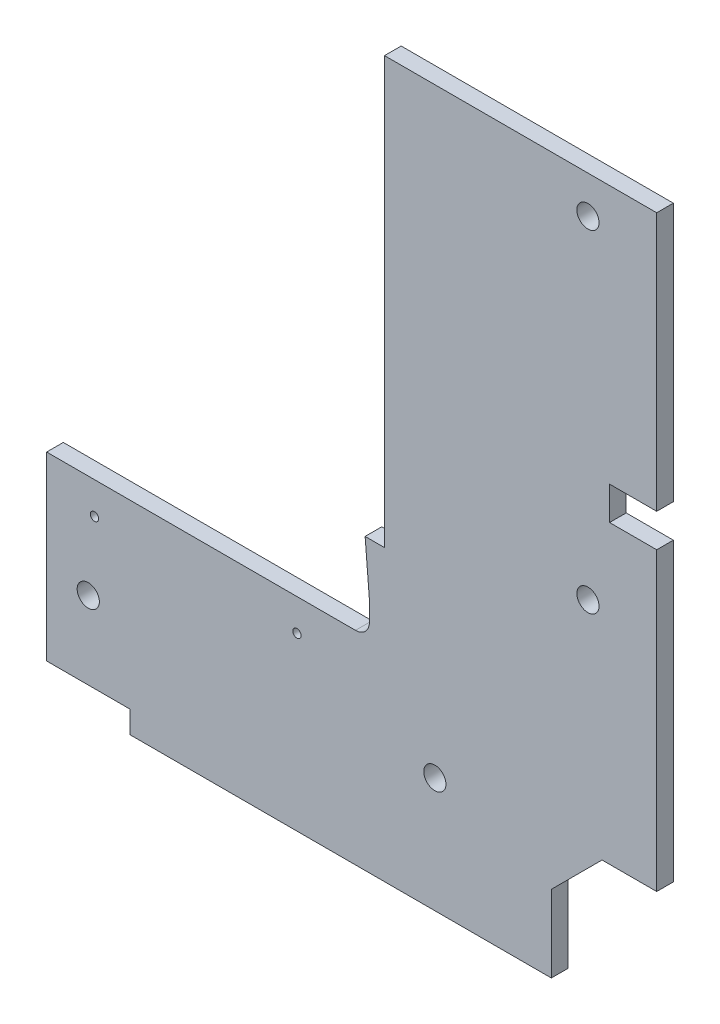
ISO-10303-21;
HEADER;
FILE_DESCRIPTION(('STEP AP214'),'2;1');
FILE_NAME('part.step','',(''),(''),'','','');
FILE_SCHEMA(('AUTOMOTIVE_DESIGN { 1 0 10303 214 1 1 1 1 }'));
ENDSEC;
DATA;
#1=APPLICATION_CONTEXT('core data for automotive mechanical design processes');
#2=APPLICATION_PROTOCOL_DEFINITION('international standard','automotive_design',2000,#1);
#3=PRODUCT_CONTEXT('',#1,'mechanical');
#4=PRODUCT('Part','Part','',(#3));
#5=PRODUCT_RELATED_PRODUCT_CATEGORY('part','',(#4));
#6=PRODUCT_DEFINITION_FORMATION('','',#4);
#7=PRODUCT_DEFINITION_CONTEXT('part definition',#1,'design');
#8=PRODUCT_DEFINITION('design','',#6,#7);
#9=PRODUCT_DEFINITION_SHAPE('','',#8);
#10=(LENGTH_UNIT() NAMED_UNIT(*) SI_UNIT(.MILLI.,.METRE.));
#11=(NAMED_UNIT(*) PLANE_ANGLE_UNIT() SI_UNIT($,.RADIAN.));
#12=(NAMED_UNIT(*) SI_UNIT($,.STERADIAN.) SOLID_ANGLE_UNIT());
#13=UNCERTAINTY_MEASURE_WITH_UNIT(LENGTH_MEASURE(1.E-05),#10,'distance_accuracy_value','');
#14=(GEOMETRIC_REPRESENTATION_CONTEXT(3) GLOBAL_UNCERTAINTY_ASSIGNED_CONTEXT((#13)) GLOBAL_UNIT_ASSIGNED_CONTEXT((#10,
#11,#12)) REPRESENTATION_CONTEXT('',''));
#15=CARTESIAN_POINT('',(0.,0.,0.));
#16=DIRECTION('',(0.,0.,1.));
#17=DIRECTION('',(1.,0.,0.));
#18=AXIS2_PLACEMENT_3D('',#15,#16,#17);
#19=CARTESIAN_POINT('',(0.,259.8,6.));
#20=DIRECTION('',(-1.,0.,0.));
#21=DIRECTION('',(0.,-1.,0.));
#22=AXIS2_PLACEMENT_3D('',#19,#20,#21);
#23=PLANE('',#22);
#24=DIRECTION('',(0.,1.,0.));
#25=VECTOR('',#24,1.);
#26=CARTESIAN_POINT('',(0.,259.8,0.));
#27=LINE('',#26,#25);
#28=CARTESIAN_POINT('',(0.,46.3,0.));
#29=VERTEX_POINT('',#28);
#30=CARTESIAN_POINT('',(0.,153.05,0.));
#31=VERTEX_POINT('',#30);
#32=EDGE_CURVE('E199',#29,#31,#27,.T.);
#33=ORIENTED_EDGE('',*,*,#32,.T.);
#34=DIRECTION('',(0.,0.,1.));
#35=VECTOR('',#34,1.);
#36=CARTESIAN_POINT('',(0.,153.05,-4.));
#37=LINE('',#36,#35);
#38=CARTESIAN_POINT('',(0.,153.05,6.));
#39=VERTEX_POINT('',#38);
#40=EDGE_CURVE('E236',#31,#39,#37,.T.);
#41=ORIENTED_EDGE('',*,*,#40,.T.);
#42=DIRECTION('',(0.,1.,0.));
#43=VECTOR('',#42,1.);
#44=CARTESIAN_POINT('',(0.,259.8,6.));
#45=LINE('',#44,#43);
#46=CARTESIAN_POINT('',(0.,46.3,6.));
#47=VERTEX_POINT('',#46);
#48=EDGE_CURVE('E409',#47,#39,#45,.T.);
#49=ORIENTED_EDGE('',*,*,#48,.F.);
#50=DIRECTION('',(0.,0.,1.));
#51=VECTOR('',#50,1.);
#52=CARTESIAN_POINT('',(0.,46.3,0.));
#53=LINE('',#52,#51);
#54=EDGE_CURVE('E362',#29,#47,#53,.T.);
#55=ORIENTED_EDGE('',*,*,#54,.F.);
#56=EDGE_LOOP('',(#33,#41,#49,#55));
#57=FACE_BOUND('',#56,.T.);
#58=ADVANCED_FACE('F43',(#57),#23,.F.);
#59=CARTESIAN_POINT('',(0.,165.05,0.));
#60=VERTEX_POINT('',#59);
#61=CARTESIAN_POINT('',(0.,258.3,0.));
#62=VERTEX_POINT('',#61);
#63=EDGE_CURVE('E191',#60,#62,#27,.T.);
#64=ORIENTED_EDGE('',*,*,#63,.T.);
#65=DIRECTION('',(0.,0.,1.));
#66=VECTOR('',#65,1.);
#67=CARTESIAN_POINT('',(0.,258.3,0.));
#68=LINE('',#67,#66);
#69=CARTESIAN_POINT('',(0.,258.3,6.));
#70=VERTEX_POINT('',#69);
#71=EDGE_CURVE('E173',#62,#70,#68,.T.);
#72=ORIENTED_EDGE('',*,*,#71,.T.);
#73=CARTESIAN_POINT('',(0.,165.05,6.));
#74=VERTEX_POINT('',#73);
#75=EDGE_CURVE('E216',#74,#70,#45,.T.);
#76=ORIENTED_EDGE('',*,*,#75,.F.);
#77=DIRECTION('',(0.,0.,1.));
#78=VECTOR('',#77,1.);
#79=CARTESIAN_POINT('',(0.,165.05,-4.));
#80=LINE('',#79,#78);
#81=EDGE_CURVE('E197',#60,#74,#80,.T.);
#82=ORIENTED_EDGE('',*,*,#81,.F.);
#83=EDGE_LOOP('',(#64,#72,#76,#82));
#84=FACE_BOUND('',#83,.T.);
#85=ADVANCED_FACE('F45',(#84),#23,.F.);
#86=CARTESIAN_POINT('',(-220.,0.,6.));
#87=DIRECTION('',(1.,0.,0.));
#88=DIRECTION('',(0.,0.,-1.));
#89=AXIS2_PLACEMENT_3D('',#86,#87,#88);
#90=PLANE('',#89);
#91=DIRECTION('',(0.,-1.,0.));
#92=VECTOR('',#91,1.);
#93=CARTESIAN_POINT('',(-220.,0.,0.));
#94=LINE('',#93,#92);
#95=CARTESIAN_POINT('',(-220.,73.57,0.));
#96=VERTEX_POINT('',#95);
#97=CARTESIAN_POINT('',(-220.,8.29999999999997,0.));
#98=VERTEX_POINT('',#97);
#99=EDGE_CURVE('E205',#96,#98,#94,.T.);
#100=ORIENTED_EDGE('',*,*,#99,.T.);
#101=DIRECTION('',(0.,0.,1.));
#102=VECTOR('',#101,1.);
#103=CARTESIAN_POINT('',(-220.,8.29999999999997,0.));
#104=LINE('',#103,#102);
#105=CARTESIAN_POINT('',(-220.,8.29999999999997,6.));
#106=VERTEX_POINT('',#105);
#107=EDGE_CURVE('E200',#98,#106,#104,.T.);
#108=ORIENTED_EDGE('',*,*,#107,.T.);
#109=DIRECTION('',(0.,-1.,0.));
#110=VECTOR('',#109,1.);
#111=CARTESIAN_POINT('',(-220.,0.,6.));
#112=LINE('',#111,#110);
#113=CARTESIAN_POINT('',(-220.,73.57,6.));
#114=VERTEX_POINT('',#113);
#115=EDGE_CURVE('E211',#114,#106,#112,.T.);
#116=ORIENTED_EDGE('',*,*,#115,.F.);
#117=DIRECTION('',(0.,0.,1.));
#118=VECTOR('',#117,1.);
#119=CARTESIAN_POINT('',(-220.,73.57,0.));
#120=LINE('',#119,#118);
#121=EDGE_CURVE('E322',#96,#114,#120,.T.);
#122=ORIENTED_EDGE('',*,*,#121,.F.);
#123=EDGE_LOOP('',(#100,#108,#116,#122));
#124=FACE_BOUND('',#123,.T.);
#125=ADVANCED_FACE('F461',(#124),#90,.F.);
#126=CARTESIAN_POINT('',(-116.389393610517,86.3461185088257,6.));
#127=DIRECTION('',(0.,0.,1.));
#128=DIRECTION('',(1.,0.,0.));
#129=AXIS2_PLACEMENT_3D('',#126,#127,#128);
#130=PLANE('',#129);
#131=DIRECTION('',(1.,0.,0.));
#132=VECTOR('',#131,1.);
#133=CARTESIAN_POINT('',(-98.1575266786795,258.3,6.));
#134=LINE('',#133,#132);
#135=CARTESIAN_POINT('',(-98.1575266786795,258.3,6.));
#136=VERTEX_POINT('',#135);
#137=EDGE_CURVE('E176',#136,#70,#134,.T.);
#138=ORIENTED_EDGE('',*,*,#137,.F.);
#139=DIRECTION('',(0.,-1.,0.));
#140=VECTOR('',#139,1.);
#141=CARTESIAN_POINT('',(-98.1575266786795,104.64,6.));
#142=LINE('',#141,#140);
#143=CARTESIAN_POINT('',(-98.1575266786795,104.64,6.));
#144=VERTEX_POINT('',#143);
#145=EDGE_CURVE('E182',#136,#144,#142,.T.);
#146=ORIENTED_EDGE('',*,*,#145,.T.);
#147=DIRECTION('',(-1.,0.,0.));
#148=VECTOR('',#147,1.);
#149=CARTESIAN_POINT('',(-98.1575266786795,104.64,6.));
#150=LINE('',#149,#148);
#151=CARTESIAN_POINT('',(-105.154959957925,104.64,6.));
#152=VERTEX_POINT('',#151);
#153=EDGE_CURVE('E329',#144,#152,#150,.T.);
#154=ORIENTED_EDGE('',*,*,#153,.T.);
#155=DIRECTION('',(0.0812879696273212,-0.996690657121791,0.));
#156=VECTOR('',#155,1.);
#157=CARTESIAN_POINT('',(-105.,102.74,6.));
#158=LINE('',#157,#156);
#159=CARTESIAN_POINT('',(-103.622774873519,85.8535231620348,6.));
#160=VERTEX_POINT('',#159);
#161=EDGE_CURVE('E342',#152,#160,#158,.T.);
#162=ORIENTED_EDGE('',*,*,#161,.T.);
#163=DIRECTION('',(0.,1.,0.));
#164=VECTOR('',#163,1.);
#165=CARTESIAN_POINT('',(-103.622774873519,85.8535231620348,6.));
#166=LINE('',#165,#164);
#167=CARTESIAN_POINT('',(-103.622774873519,78.57,6.));
#168=VERTEX_POINT('',#167);
#169=EDGE_CURVE('E281',#168,#160,#166,.T.);
#170=ORIENTED_EDGE('',*,*,#169,.F.);
#171=CARTESIAN_POINT('',(-108.622774873519,78.57,6.));
#172=DIRECTION('',(0.,0.,1.));
#173=DIRECTION('',(1.,0.,0.));
#174=AXIS2_PLACEMENT_3D('',#171,#172,#173);
#175=CIRCLE('',#174,5.);
#176=CARTESIAN_POINT('',(-108.622774873519,73.57,6.));
#177=VERTEX_POINT('',#176);
#178=EDGE_CURVE('E275',#177,#168,#175,.T.);
#179=ORIENTED_EDGE('',*,*,#178,.F.);
#180=DIRECTION('',(-1.,0.,0.));
#181=VECTOR('',#180,1.);
#182=CARTESIAN_POINT('',(-220.,73.57,6.));
#183=LINE('',#182,#181);
#184=EDGE_CURVE('E317',#177,#114,#183,.T.);
#185=ORIENTED_EDGE('',*,*,#184,.T.);
#186=ORIENTED_EDGE('',*,*,#115,.T.);
#187=DIRECTION('',(-1.,0.,0.));
#188=VECTOR('',#187,1.);
#189=CARTESIAN_POINT('',(-220.,8.29999999999997,6.));
#190=LINE('',#189,#188);
#191=CARTESIAN_POINT('',(-190.,8.29999999999997,6.));
#192=VERTEX_POINT('',#191);
#193=EDGE_CURVE('E399',#192,#106,#190,.T.);
#194=ORIENTED_EDGE('',*,*,#193,.F.);
#195=DIRECTION('',(0.,1.,0.));
#196=VECTOR('',#195,1.);
#197=CARTESIAN_POINT('',(-190.,0.,6.));
#198=LINE('',#197,#196);
#199=CARTESIAN_POINT('',(-190.,0.299999999999973,6.));
#200=VERTEX_POINT('',#199);
#201=EDGE_CURVE('E383',#200,#192,#198,.T.);
#202=ORIENTED_EDGE('',*,*,#201,.F.);
#203=DIRECTION('',(-1.,0.,0.));
#204=VECTOR('',#203,1.);
#205=CARTESIAN_POINT('',(-190.,0.299999999999973,6.));
#206=LINE('',#205,#204);
#207=CARTESIAN_POINT('',(-38.,0.299999999999973,6.));
#208=VERTEX_POINT('',#207);
#209=EDGE_CURVE('E261',#208,#200,#206,.T.);
#210=ORIENTED_EDGE('',*,*,#209,.F.);
#211=DIRECTION('',(0.,-1.,0.));
#212=VECTOR('',#211,1.);
#213=CARTESIAN_POINT('',(-38.,0.,6.));
#214=LINE('',#213,#212);
#215=CARTESIAN_POINT('',(-38.,28.,6.));
#216=VERTEX_POINT('',#215);
#217=EDGE_CURVE('E358',#216,#208,#214,.T.);
#218=ORIENTED_EDGE('',*,*,#217,.F.);
#219=DIRECTION('',(-0.707106781186547,-0.707106781186548,0.));
#220=VECTOR('',#219,1.);
#221=CARTESIAN_POINT('',(-38.,28.,6.));
#222=LINE('',#221,#220);
#223=CARTESIAN_POINT('',(-19.7,46.3,6.));
#224=VERTEX_POINT('',#223);
#225=EDGE_CURVE('E241',#224,#216,#222,.T.);
#226=ORIENTED_EDGE('',*,*,#225,.F.);
#227=DIRECTION('',(-1.,0.,0.));
#228=VECTOR('',#227,1.);
#229=CARTESIAN_POINT('',(-10.7,46.3,6.));
#230=LINE('',#229,#228);
#231=EDGE_CURVE('E350',#47,#224,#230,.T.);
#232=ORIENTED_EDGE('',*,*,#231,.F.);
#233=ORIENTED_EDGE('',*,*,#48,.T.);
#234=DIRECTION('',(1.,0.,0.));
#235=VECTOR('',#234,1.);
#236=CARTESIAN_POINT('',(0.,153.05,6.));
#237=LINE('',#236,#235);
#238=CARTESIAN_POINT('',(-17.,153.05,6.));
#239=VERTEX_POINT('',#238);
#240=EDGE_CURVE('E248',#239,#39,#237,.T.);
#241=ORIENTED_EDGE('',*,*,#240,.F.);
#242=DIRECTION('',(0.,-1.,0.));
#243=VECTOR('',#242,1.);
#244=CARTESIAN_POINT('',(-17.,153.05,6.));
#245=LINE('',#244,#243);
#246=CARTESIAN_POINT('',(-17.,165.05,6.));
#247=VERTEX_POINT('',#246);
#248=EDGE_CURVE('E232',#247,#239,#245,.T.);
#249=ORIENTED_EDGE('',*,*,#248,.F.);
#250=DIRECTION('',(-1.,0.,0.));
#251=VECTOR('',#250,1.);
#252=CARTESIAN_POINT('',(0.,165.05,6.));
#253=LINE('',#252,#251);
#254=EDGE_CURVE('E422',#74,#247,#253,.T.);
#255=ORIENTED_EDGE('',*,*,#254,.F.);
#256=ORIENTED_EDGE('',*,*,#75,.T.);
#257=EDGE_LOOP('',(#138,#146,#154,#162,#170,#179,#185,#186,#194,#202,#210,#218,#226,#232,#233,
#241,#249,#255,#256));
#258=FACE_BOUND('',#257,.T.);
#259=CARTESIAN_POINT('',(-80.,41.8,6.));
#260=DIRECTION('',(0.,0.,1.));
#261=DIRECTION('',(1.,0.,0.));
#262=AXIS2_PLACEMENT_3D('',#259,#260,#261);
#263=CIRCLE('',#262,4.00000000000001);
#264=CARTESIAN_POINT('',(-76.,41.8,6.));
#265=VERTEX_POINT('',#264);
#266=EDGE_CURVE('E430',#265,#265,#263,.T.);
#267=ORIENTED_EDGE('',*,*,#266,.F.);
#268=EDGE_LOOP('',(#267));
#269=FACE_BOUND('',#268,.T.);
#270=CARTESIAN_POINT('',(-202.75,62.07,6.));
#271=DIRECTION('',(0.,0.,1.));
#272=DIRECTION('',(1.,0.,0.));
#273=AXIS2_PLACEMENT_3D('',#270,#271,#272);
#274=CIRCLE('',#273,1.5);
#275=CARTESIAN_POINT('',(-201.25,62.07,6.));
#276=VERTEX_POINT('',#275);
#277=EDGE_CURVE('E303',#276,#276,#274,.T.);
#278=ORIENTED_EDGE('',*,*,#277,.F.);
#279=EDGE_LOOP('',(#278));
#280=FACE_BOUND('',#279,.T.);
#281=CARTESIAN_POINT('',(-129.75,62.07,6.));
#282=DIRECTION('',(0.,0.,1.));
#283=DIRECTION('',(1.,0.,0.));
#284=AXIS2_PLACEMENT_3D('',#281,#282,#283);
#285=CIRCLE('',#284,1.5);
#286=CARTESIAN_POINT('',(-128.25,62.07,6.));
#287=VERTEX_POINT('',#286);
#288=EDGE_CURVE('E294',#287,#287,#285,.T.);
#289=ORIENTED_EDGE('',*,*,#288,.F.);
#290=EDGE_LOOP('',(#289));
#291=FACE_BOUND('',#290,.T.);
#292=CARTESIAN_POINT('',(-24.8,125.,6.));
#293=DIRECTION('',(0.,0.,1.));
#294=DIRECTION('',(1.,0.,0.));
#295=AXIS2_PLACEMENT_3D('',#292,#293,#294);
#296=CIRCLE('',#295,4.00000000000001);
#297=CARTESIAN_POINT('',(-20.8,125.,6.));
#298=VERTEX_POINT('',#297);
#299=EDGE_CURVE('E370',#298,#298,#296,.T.);
#300=ORIENTED_EDGE('',*,*,#299,.F.);
#301=EDGE_LOOP('',(#300));
#302=FACE_BOUND('',#301,.T.);
#303=CARTESIAN_POINT('',(-24.8,244.8,6.));
#304=DIRECTION('',(0.,0.,1.));
#305=DIRECTION('',(1.,0.,0.));
#306=AXIS2_PLACEMENT_3D('',#303,#304,#305);
#307=CIRCLE('',#306,4.00000000000001);
#308=CARTESIAN_POINT('',(-20.8,244.8,6.));
#309=VERTEX_POINT('',#308);
#310=EDGE_CURVE('E375',#309,#309,#307,.T.);
#311=ORIENTED_EDGE('',*,*,#310,.F.);
#312=EDGE_LOOP('',(#311));
#313=FACE_BOUND('',#312,.T.);
#314=CARTESIAN_POINT('',(-205.,36.3,6.));
#315=DIRECTION('',(0.,0.,1.));
#316=DIRECTION('',(1.,0.,0.));
#317=AXIS2_PLACEMENT_3D('',#314,#315,#316);
#318=CIRCLE('',#317,3.99999999999999);
#319=CARTESIAN_POINT('',(-201.,36.3,6.));
#320=VERTEX_POINT('',#319);
#321=EDGE_CURVE('E384',#320,#320,#318,.T.);
#322=ORIENTED_EDGE('',*,*,#321,.F.);
#323=EDGE_LOOP('',(#322));
#324=FACE_BOUND('',#323,.T.);
#325=ADVANCED_FACE('F419',(#258,#269,#280,#291,#302,#313,#324),#130,.T.);
#326=CARTESIAN_POINT('',(-116.389393610517,86.3461185088257,0.));
#327=DIRECTION('',(0.,0.,1.));
#328=DIRECTION('',(1.,0.,0.));
#329=AXIS2_PLACEMENT_3D('',#326,#327,#328);
#330=PLANE('',#329);
#331=CARTESIAN_POINT('',(-202.75,62.07,0.));
#332=DIRECTION('',(0.,0.,1.));
#333=DIRECTION('',(1.,0.,0.));
#334=AXIS2_PLACEMENT_3D('',#331,#332,#333);
#335=CIRCLE('',#334,1.5);
#336=CARTESIAN_POINT('',(-201.25,62.07,0.));
#337=VERTEX_POINT('',#336);
#338=EDGE_CURVE('E298',#337,#337,#335,.T.);
#339=ORIENTED_EDGE('',*,*,#338,.T.);
#340=EDGE_LOOP('',(#339));
#341=FACE_BOUND('',#340,.T.);
#342=CARTESIAN_POINT('',(-129.75,62.07,0.));
#343=DIRECTION('',(0.,0.,1.));
#344=DIRECTION('',(1.,0.,0.));
#345=AXIS2_PLACEMENT_3D('',#342,#343,#344);
#346=CIRCLE('',#345,1.5);
#347=CARTESIAN_POINT('',(-128.25,62.07,0.));
#348=VERTEX_POINT('',#347);
#349=EDGE_CURVE('E307',#348,#348,#346,.T.);
#350=ORIENTED_EDGE('',*,*,#349,.T.);
#351=EDGE_LOOP('',(#350));
#352=FACE_BOUND('',#351,.T.);
#353=DIRECTION('',(0.,-1.,0.));
#354=VECTOR('',#353,1.);
#355=CARTESIAN_POINT('',(-98.1575266786795,104.64,0.));
#356=LINE('',#355,#354);
#357=CARTESIAN_POINT('',(-98.1575266786795,258.3,0.));
#358=VERTEX_POINT('',#357);
#359=CARTESIAN_POINT('',(-98.1575266786795,104.64,0.));
#360=VERTEX_POINT('',#359);
#361=EDGE_CURVE('E193',#358,#360,#356,.T.);
#362=ORIENTED_EDGE('',*,*,#361,.F.);
#363=DIRECTION('',(1.,0.,0.));
#364=VECTOR('',#363,1.);
#365=CARTESIAN_POINT('',(-98.1575266786795,258.3,0.));
#366=LINE('',#365,#364);
#367=EDGE_CURVE('E59',#358,#62,#366,.T.);
#368=ORIENTED_EDGE('',*,*,#367,.T.);
#369=ORIENTED_EDGE('',*,*,#63,.F.);
#370=DIRECTION('',(-1.,0.,0.));
#371=VECTOR('',#370,1.);
#372=CARTESIAN_POINT('',(-116.389393610517,165.05,0.));
#373=LINE('',#372,#371);
#374=CARTESIAN_POINT('',(-17.,165.05,0.));
#375=VERTEX_POINT('',#374);
#376=EDGE_CURVE('E221',#60,#375,#373,.T.);
#377=ORIENTED_EDGE('',*,*,#376,.T.);
#378=DIRECTION('',(0.,-1.,0.));
#379=VECTOR('',#378,1.);
#380=CARTESIAN_POINT('',(-17.,86.3461185088257,0.));
#381=LINE('',#380,#379);
#382=CARTESIAN_POINT('',(-17.,153.05,0.));
#383=VERTEX_POINT('',#382);
#384=EDGE_CURVE('E52',#375,#383,#381,.T.);
#385=ORIENTED_EDGE('',*,*,#384,.T.);
#386=DIRECTION('',(1.,0.,0.));
#387=VECTOR('',#386,1.);
#388=CARTESIAN_POINT('',(-116.389393610517,153.05,0.));
#389=LINE('',#388,#387);
#390=EDGE_CURVE('E11',#383,#31,#389,.T.);
#391=ORIENTED_EDGE('',*,*,#390,.T.);
#392=ORIENTED_EDGE('',*,*,#32,.F.);
#393=DIRECTION('',(-1.,0.,0.));
#394=VECTOR('',#393,1.);
#395=CARTESIAN_POINT('',(-10.7,46.3,0.));
#396=LINE('',#395,#394);
#397=CARTESIAN_POINT('',(-19.7,46.3,0.));
#398=VERTEX_POINT('',#397);
#399=EDGE_CURVE('E354',#29,#398,#396,.T.);
#400=ORIENTED_EDGE('',*,*,#399,.T.);
#401=DIRECTION('',(-0.707106781186547,-0.707106781186548,0.));
#402=VECTOR('',#401,1.);
#403=CARTESIAN_POINT('',(-38.,28.,0.));
#404=LINE('',#403,#402);
#405=CARTESIAN_POINT('',(-38.,28.,0.));
#406=VERTEX_POINT('',#405);
#407=EDGE_CURVE('E249',#398,#406,#404,.T.);
#408=ORIENTED_EDGE('',*,*,#407,.T.);
#409=DIRECTION('',(0.,-1.,0.));
#410=VECTOR('',#409,1.);
#411=CARTESIAN_POINT('',(-38.,0.,0.));
#412=LINE('',#411,#410);
#413=CARTESIAN_POINT('',(-38.,0.299999999999973,0.));
#414=VERTEX_POINT('',#413);
#415=EDGE_CURVE('E357',#406,#414,#412,.T.);
#416=ORIENTED_EDGE('',*,*,#415,.T.);
#417=DIRECTION('',(-1.,0.,0.));
#418=VECTOR('',#417,1.);
#419=CARTESIAN_POINT('',(-116.389393610517,0.299999999999967,0.));
#420=LINE('',#419,#418);
#421=CARTESIAN_POINT('',(-190.,0.299999999999973,0.));
#422=VERTEX_POINT('',#421);
#423=EDGE_CURVE('E271',#414,#422,#420,.T.);
#424=ORIENTED_EDGE('',*,*,#423,.T.);
#425=DIRECTION('',(0.,1.,0.));
#426=VECTOR('',#425,1.);
#427=CARTESIAN_POINT('',(-190.,0.,0.));
#428=LINE('',#427,#426);
#429=CARTESIAN_POINT('',(-190.,8.29999999999997,0.));
#430=VERTEX_POINT('',#429);
#431=EDGE_CURVE('E395',#422,#430,#428,.T.);
#432=ORIENTED_EDGE('',*,*,#431,.T.);
#433=DIRECTION('',(-1.,0.,0.));
#434=VECTOR('',#433,1.);
#435=CARTESIAN_POINT('',(-220.,8.29999999999997,0.));
#436=LINE('',#435,#434);
#437=EDGE_CURVE('E398',#430,#98,#436,.T.);
#438=ORIENTED_EDGE('',*,*,#437,.T.);
#439=ORIENTED_EDGE('',*,*,#99,.F.);
#440=DIRECTION('',(-1.,0.,0.));
#441=VECTOR('',#440,1.);
#442=CARTESIAN_POINT('',(-220.,73.57,0.));
#443=LINE('',#442,#441);
#444=CARTESIAN_POINT('',(-108.622774873519,73.57,0.));
#445=VERTEX_POINT('',#444);
#446=EDGE_CURVE('E318',#445,#96,#443,.T.);
#447=ORIENTED_EDGE('',*,*,#446,.F.);
#448=CARTESIAN_POINT('',(-108.622774873519,78.57,0.));
#449=DIRECTION('',(0.,0.,1.));
#450=DIRECTION('',(1.,0.,0.));
#451=AXIS2_PLACEMENT_3D('',#448,#449,#450);
#452=CIRCLE('',#451,5.);
#453=CARTESIAN_POINT('',(-103.622774873519,78.57,0.));
#454=VERTEX_POINT('',#453);
#455=EDGE_CURVE('E276',#445,#454,#452,.T.);
#456=ORIENTED_EDGE('',*,*,#455,.T.);
#457=DIRECTION('',(0.,1.,0.));
#458=VECTOR('',#457,1.);
#459=CARTESIAN_POINT('',(-103.622774873519,85.8535231620348,0.));
#460=LINE('',#459,#458);
#461=CARTESIAN_POINT('',(-103.622774873519,85.8535231620348,0.));
#462=VERTEX_POINT('',#461);
#463=EDGE_CURVE('E280',#454,#462,#460,.T.);
#464=ORIENTED_EDGE('',*,*,#463,.T.);
#465=DIRECTION('',(0.0812879696273212,-0.996690657121791,0.));
#466=VECTOR('',#465,1.);
#467=CARTESIAN_POINT('',(-105.,102.74,0.));
#468=LINE('',#467,#466);
#469=CARTESIAN_POINT('',(-105.154959957925,104.64,0.));
#470=VERTEX_POINT('',#469);
#471=EDGE_CURVE('E346',#470,#462,#468,.T.);
#472=ORIENTED_EDGE('',*,*,#471,.F.);
#473=DIRECTION('',(-1.,0.,0.));
#474=VECTOR('',#473,1.);
#475=CARTESIAN_POINT('',(-98.1575266786795,104.64,0.));
#476=LINE('',#475,#474);
#477=EDGE_CURVE('E330',#360,#470,#476,.T.);
#478=ORIENTED_EDGE('',*,*,#477,.F.);
#479=EDGE_LOOP('',(#362,#368,#369,#377,#385,#391,#392,#400,#408,#416,#424,#432,#438,#439,#447,
#456,#464,#472,#478));
#480=FACE_BOUND('',#479,.T.);
#481=CARTESIAN_POINT('',(-80.,41.8,0.));
#482=DIRECTION('',(0.,0.,1.));
#483=DIRECTION('',(1.,0.,0.));
#484=AXIS2_PLACEMENT_3D('',#481,#482,#483);
#485=CIRCLE('',#484,4.00000000000001);
#486=CARTESIAN_POINT('',(-76.,41.8,0.));
#487=VERTEX_POINT('',#486);
#488=EDGE_CURVE('E424',#487,#487,#485,.T.);
#489=ORIENTED_EDGE('',*,*,#488,.T.);
#490=EDGE_LOOP('',(#489));
#491=FACE_BOUND('',#490,.T.);
#492=CARTESIAN_POINT('',(-24.8,125.,0.));
#493=DIRECTION('',(0.,0.,1.));
#494=DIRECTION('',(1.,0.,0.));
#495=AXIS2_PLACEMENT_3D('',#492,#493,#494);
#496=CIRCLE('',#495,4.00000000000001);
#497=CARTESIAN_POINT('',(-20.8,125.,0.));
#498=VERTEX_POINT('',#497);
#499=EDGE_CURVE('E371',#498,#498,#496,.T.);
#500=ORIENTED_EDGE('',*,*,#499,.T.);
#501=EDGE_LOOP('',(#500));
#502=FACE_BOUND('',#501,.T.);
#503=CARTESIAN_POINT('',(-24.8,244.8,0.));
#504=DIRECTION('',(0.,0.,1.));
#505=DIRECTION('',(1.,0.,0.));
#506=AXIS2_PLACEMENT_3D('',#503,#504,#505);
#507=CIRCLE('',#506,4.00000000000001);
#508=CARTESIAN_POINT('',(-20.8,244.8,0.));
#509=VERTEX_POINT('',#508);
#510=EDGE_CURVE('E388',#509,#509,#507,.T.);
#511=ORIENTED_EDGE('',*,*,#510,.T.);
#512=EDGE_LOOP('',(#511));
#513=FACE_BOUND('',#512,.T.);
#514=CARTESIAN_POINT('',(-205.,36.3,0.));
#515=DIRECTION('',(0.,0.,1.));
#516=DIRECTION('',(1.,0.,0.));
#517=AXIS2_PLACEMENT_3D('',#514,#515,#516);
#518=CIRCLE('',#517,3.99999999999999);
#519=CARTESIAN_POINT('',(-201.,36.3,0.));
#520=VERTEX_POINT('',#519);
#521=EDGE_CURVE('E379',#520,#520,#518,.T.);
#522=ORIENTED_EDGE('',*,*,#521,.T.);
#523=EDGE_LOOP('',(#522));
#524=FACE_BOUND('',#523,.T.);
#525=ADVANCED_FACE('F188',(#341,#352,#480,#491,#502,#513,#524),#330,.F.);
#526=CARTESIAN_POINT('',(-220.,8.29999999999997,0.));
#527=DIRECTION('',(0.,1.,0.));
#528=DIRECTION('',(0.,0.,1.));
#529=AXIS2_PLACEMENT_3D('',#526,#527,#528);
#530=PLANE('',#529);
#531=ORIENTED_EDGE('',*,*,#193,.T.);
#532=ORIENTED_EDGE('',*,*,#107,.F.);
#533=ORIENTED_EDGE('',*,*,#437,.F.);
#534=DIRECTION('',(0.,0.,1.));
#535=VECTOR('',#534,1.);
#536=CARTESIAN_POINT('',(-190.,8.29999999999997,0.));
#537=LINE('',#536,#535);
#538=EDGE_CURVE('E207',#430,#192,#537,.T.);
#539=ORIENTED_EDGE('',*,*,#538,.T.);
#540=EDGE_LOOP('',(#531,#532,#533,#539));
#541=FACE_BOUND('',#540,.T.);
#542=ADVANCED_FACE('F456',(#541),#530,.F.);
#543=CARTESIAN_POINT('',(-190.,0.,0.));
#544=DIRECTION('',(1.,0.,0.));
#545=DIRECTION('',(0.,0.,-1.));
#546=AXIS2_PLACEMENT_3D('',#543,#544,#545);
#547=PLANE('',#546);
#548=ORIENTED_EDGE('',*,*,#431,.F.);
#549=DIRECTION('',(0.,0.,1.));
#550=VECTOR('',#549,1.);
#551=CARTESIAN_POINT('',(-190.,0.299999999999973,-4.));
#552=LINE('',#551,#550);
#553=EDGE_CURVE('E267',#422,#200,#552,.T.);
#554=ORIENTED_EDGE('',*,*,#553,.T.);
#555=ORIENTED_EDGE('',*,*,#201,.T.);
#556=ORIENTED_EDGE('',*,*,#538,.F.);
#557=EDGE_LOOP('',(#548,#554,#555,#556));
#558=FACE_BOUND('',#557,.T.);
#559=ADVANCED_FACE('F452',(#558),#547,.F.);
#560=CARTESIAN_POINT('',(-38.,0.,0.));
#561=DIRECTION('',(-1.,0.,0.));
#562=DIRECTION('',(0.,-1.,0.));
#563=AXIS2_PLACEMENT_3D('',#560,#561,#562);
#564=PLANE('',#563);
#565=ORIENTED_EDGE('',*,*,#217,.T.);
#566=DIRECTION('',(0.,0.,-1.));
#567=VECTOR('',#566,1.);
#568=CARTESIAN_POINT('',(-38.,0.299999999999973,0.));
#569=LINE('',#568,#567);
#570=EDGE_CURVE('E217',#208,#414,#569,.T.);
#571=ORIENTED_EDGE('',*,*,#570,.T.);
#572=ORIENTED_EDGE('',*,*,#415,.F.);
#573=DIRECTION('',(0.,0.,1.));
#574=VECTOR('',#573,1.);
#575=CARTESIAN_POINT('',(-38.,28.,0.));
#576=LINE('',#575,#574);
#577=EDGE_CURVE('E257',#406,#216,#576,.T.);
#578=ORIENTED_EDGE('',*,*,#577,.T.);
#579=EDGE_LOOP('',(#565,#571,#572,#578));
#580=FACE_BOUND('',#579,.T.);
#581=ADVANCED_FACE('F446',(#580),#564,.F.);
#582=CARTESIAN_POINT('',(-10.7,46.3,0.));
#583=DIRECTION('',(0.,1.,0.));
#584=DIRECTION('',(0.,0.,1.));
#585=AXIS2_PLACEMENT_3D('',#582,#583,#584);
#586=PLANE('',#585);
#587=ORIENTED_EDGE('',*,*,#231,.T.);
#588=DIRECTION('',(0.,0.,1.));
#589=VECTOR('',#588,1.);
#590=CARTESIAN_POINT('',(-19.7,46.3,0.));
#591=LINE('',#590,#589);
#592=EDGE_CURVE('E253',#398,#224,#591,.T.);
#593=ORIENTED_EDGE('',*,*,#592,.F.);
#594=ORIENTED_EDGE('',*,*,#399,.F.);
#595=ORIENTED_EDGE('',*,*,#54,.T.);
#596=EDGE_LOOP('',(#587,#593,#594,#595));
#597=FACE_BOUND('',#596,.T.);
#598=ADVANCED_FACE('F440',(#597),#586,.F.);
#599=CARTESIAN_POINT('',(-205.,36.3,0.));
#600=DIRECTION('',(0.,0.,1.));
#601=DIRECTION('',(1.,0.,0.));
#602=AXIS2_PLACEMENT_3D('',#599,#600,#601);
#603=CYLINDRICAL_SURFACE('',#602,3.99999999999999);
#604=ORIENTED_EDGE('',*,*,#521,.F.);
#605=EDGE_LOOP('',(#604));
#606=FACE_BOUND('',#605,.T.);
#607=ORIENTED_EDGE('',*,*,#321,.T.);
#608=EDGE_LOOP('',(#607));
#609=FACE_BOUND('',#608,.T.);
#610=ADVANCED_FACE('F507',(#606,#609),#603,.F.);
#611=CARTESIAN_POINT('',(-24.8,244.8,0.));
#612=DIRECTION('',(0.,0.,1.));
#613=DIRECTION('',(1.,0.,0.));
#614=AXIS2_PLACEMENT_3D('',#611,#612,#613);
#615=CYLINDRICAL_SURFACE('',#614,4.00000000000001);
#616=ORIENTED_EDGE('',*,*,#510,.F.);
#617=EDGE_LOOP('',(#616));
#618=FACE_BOUND('',#617,.T.);
#619=ORIENTED_EDGE('',*,*,#310,.T.);
#620=EDGE_LOOP('',(#619));
#621=FACE_BOUND('',#620,.T.);
#622=ADVANCED_FACE('F509',(#618,#621),#615,.F.);
#623=CARTESIAN_POINT('',(-24.8,125.,0.));
#624=DIRECTION('',(0.,0.,1.));
#625=DIRECTION('',(1.,0.,0.));
#626=AXIS2_PLACEMENT_3D('',#623,#624,#625);
#627=CYLINDRICAL_SURFACE('',#626,4.00000000000001);
#628=ORIENTED_EDGE('',*,*,#499,.F.);
#629=EDGE_LOOP('',(#628));
#630=FACE_BOUND('',#629,.T.);
#631=ORIENTED_EDGE('',*,*,#299,.T.);
#632=EDGE_LOOP('',(#631));
#633=FACE_BOUND('',#632,.T.);
#634=ADVANCED_FACE('F516',(#630,#633),#627,.F.);
#635=CARTESIAN_POINT('',(-105.,102.74,0.));
#636=DIRECTION('',(-0.996690657121791,-0.0812879696273212,0.));
#637=DIRECTION('',(0.0812879696273213,-0.996690657121791,0.));
#638=AXIS2_PLACEMENT_3D('',#635,#636,#637);
#639=PLANE('',#638);
#640=DIRECTION('',(0.,0.,1.));
#641=VECTOR('',#640,1.);
#642=CARTESIAN_POINT('',(-103.622774873519,85.8535231620348,0.));
#643=LINE('',#642,#641);
#644=EDGE_CURVE('E302',#462,#160,#643,.T.);
#645=ORIENTED_EDGE('',*,*,#644,.T.);
#646=ORIENTED_EDGE('',*,*,#161,.F.);
#647=DIRECTION('',(0.,0.,1.));
#648=VECTOR('',#647,1.);
#649=CARTESIAN_POINT('',(-105.154959957925,104.64,0.));
#650=LINE('',#649,#648);
#651=EDGE_CURVE('E338',#470,#152,#650,.T.);
#652=ORIENTED_EDGE('',*,*,#651,.F.);
#653=ORIENTED_EDGE('',*,*,#471,.T.);
#654=EDGE_LOOP('',(#645,#646,#652,#653));
#655=FACE_BOUND('',#654,.T.);
#656=ADVANCED_FACE('F473',(#655),#639,.T.);
#657=CARTESIAN_POINT('',(-98.1575266786795,104.64,0.));
#658=DIRECTION('',(0.,1.,0.));
#659=DIRECTION('',(-1.,0.,0.));
#660=AXIS2_PLACEMENT_3D('',#657,#658,#659);
#661=PLANE('',#660);
#662=ORIENTED_EDGE('',*,*,#153,.F.);
#663=DIRECTION('',(0.,0.,1.));
#664=VECTOR('',#663,1.);
#665=CARTESIAN_POINT('',(-98.1575266786795,104.64,0.));
#666=LINE('',#665,#664);
#667=EDGE_CURVE('E334',#360,#144,#666,.T.);
#668=ORIENTED_EDGE('',*,*,#667,.F.);
#669=ORIENTED_EDGE('',*,*,#477,.T.);
#670=ORIENTED_EDGE('',*,*,#651,.T.);
#671=EDGE_LOOP('',(#662,#668,#669,#670));
#672=FACE_BOUND('',#671,.T.);
#673=ADVANCED_FACE('F478',(#672),#661,.T.);
#674=CARTESIAN_POINT('',(-220.,73.57,0.));
#675=DIRECTION('',(0.,1.,0.));
#676=DIRECTION('',(0.,0.,1.));
#677=AXIS2_PLACEMENT_3D('',#674,#675,#676);
#678=PLANE('',#677);
#679=ORIENTED_EDGE('',*,*,#184,.F.);
#680=DIRECTION('',(0.,0.,1.));
#681=VECTOR('',#680,1.);
#682=CARTESIAN_POINT('',(-108.622774873519,73.57,0.));
#683=LINE('',#682,#681);
#684=EDGE_CURVE('E285',#445,#177,#683,.T.);
#685=ORIENTED_EDGE('',*,*,#684,.F.);
#686=ORIENTED_EDGE('',*,*,#446,.T.);
#687=ORIENTED_EDGE('',*,*,#121,.T.);
#688=EDGE_LOOP('',(#679,#685,#686,#687));
#689=FACE_BOUND('',#688,.T.);
#690=ADVANCED_FACE('F463',(#689),#678,.T.);
#691=CARTESIAN_POINT('',(-129.75,62.07,0.));
#692=DIRECTION('',(0.,0.,1.));
#693=DIRECTION('',(1.,0.,0.));
#694=AXIS2_PLACEMENT_3D('',#691,#692,#693);
#695=CYLINDRICAL_SURFACE('',#694,1.5);
#696=ORIENTED_EDGE('',*,*,#349,.F.);
#697=EDGE_LOOP('',(#696));
#698=FACE_BOUND('',#697,.T.);
#699=ORIENTED_EDGE('',*,*,#288,.T.);
#700=EDGE_LOOP('',(#699));
#701=FACE_BOUND('',#700,.T.);
#702=ADVANCED_FACE('F668',(#698,#701),#695,.F.);
#703=CARTESIAN_POINT('',(-202.75,62.07,0.));
#704=DIRECTION('',(0.,0.,1.));
#705=DIRECTION('',(1.,0.,0.));
#706=AXIS2_PLACEMENT_3D('',#703,#704,#705);
#707=CYLINDRICAL_SURFACE('',#706,1.5);
#708=ORIENTED_EDGE('',*,*,#338,.F.);
#709=EDGE_LOOP('',(#708));
#710=FACE_BOUND('',#709,.T.);
#711=ORIENTED_EDGE('',*,*,#277,.T.);
#712=EDGE_LOOP('',(#711));
#713=FACE_BOUND('',#712,.T.);
#714=ADVANCED_FACE('F663',(#710,#713),#707,.F.);
#715=CARTESIAN_POINT('',(-103.622774873519,85.8535231620348,0.));
#716=DIRECTION('',(1.,0.,0.));
#717=DIRECTION('',(0.,0.,-1.));
#718=AXIS2_PLACEMENT_3D('',#715,#716,#717);
#719=PLANE('',#718);
#720=ORIENTED_EDGE('',*,*,#169,.T.);
#721=ORIENTED_EDGE('',*,*,#644,.F.);
#722=ORIENTED_EDGE('',*,*,#463,.F.);
#723=DIRECTION('',(0.,0.,1.));
#724=VECTOR('',#723,1.);
#725=CARTESIAN_POINT('',(-103.622774873519,78.57,0.));
#726=LINE('',#725,#724);
#727=EDGE_CURVE('E291',#454,#168,#726,.T.);
#728=ORIENTED_EDGE('',*,*,#727,.T.);
#729=EDGE_LOOP('',(#720,#721,#722,#728));
#730=FACE_BOUND('',#729,.T.);
#731=ADVANCED_FACE('F471',(#730),#719,.F.);
#732=CARTESIAN_POINT('',(-108.622774873519,78.57,0.));
#733=DIRECTION('',(0.,0.,1.));
#734=DIRECTION('',(1.,0.,0.));
#735=AXIS2_PLACEMENT_3D('',#732,#733,#734);
#736=CYLINDRICAL_SURFACE('',#735,5.);
#737=ORIENTED_EDGE('',*,*,#178,.T.);
#738=ORIENTED_EDGE('',*,*,#727,.F.);
#739=ORIENTED_EDGE('',*,*,#455,.F.);
#740=ORIENTED_EDGE('',*,*,#684,.T.);
#741=EDGE_LOOP('',(#737,#738,#739,#740));
#742=FACE_BOUND('',#741,.T.);
#743=ADVANCED_FACE('F468',(#742),#736,.F.);
#744=CARTESIAN_POINT('',(-190.,0.299999999999973,-4.));
#745=DIRECTION('',(0.,1.,0.));
#746=DIRECTION('',(0.,0.,1.));
#747=AXIS2_PLACEMENT_3D('',#744,#745,#746);
#748=PLANE('',#747);
#749=ORIENTED_EDGE('',*,*,#570,.F.);
#750=ORIENTED_EDGE('',*,*,#209,.T.);
#751=ORIENTED_EDGE('',*,*,#553,.F.);
#752=ORIENTED_EDGE('',*,*,#423,.F.);
#753=EDGE_LOOP('',(#749,#750,#751,#752));
#754=FACE_BOUND('',#753,.T.);
#755=ADVANCED_FACE('F567',(#754),#748,.F.);
#756=CARTESIAN_POINT('',(-38.,28.,0.));
#757=DIRECTION('',(-0.707106781186548,0.707106781186547,0.));
#758=DIRECTION('',(-0.707106781186547,-0.707106781186548,0.));
#759=AXIS2_PLACEMENT_3D('',#756,#757,#758);
#760=PLANE('',#759);
#761=ORIENTED_EDGE('',*,*,#225,.T.);
#762=ORIENTED_EDGE('',*,*,#577,.F.);
#763=ORIENTED_EDGE('',*,*,#407,.F.);
#764=ORIENTED_EDGE('',*,*,#592,.T.);
#765=EDGE_LOOP('',(#761,#762,#763,#764));
#766=FACE_BOUND('',#765,.T.);
#767=ADVANCED_FACE('F444',(#766),#760,.F.);
#768=CARTESIAN_POINT('',(0.,153.05,-4.));
#769=DIRECTION('',(0.,-1.,0.));
#770=DIRECTION('',(0.,0.,-1.));
#771=AXIS2_PLACEMENT_3D('',#768,#769,#770);
#772=PLANE('',#771);
#773=DIRECTION('',(0.,0.,1.));
#774=VECTOR('',#773,1.);
#775=CARTESIAN_POINT('',(-17.,153.05,-4.));
#776=LINE('',#775,#774);
#777=EDGE_CURVE('E230',#383,#239,#776,.T.);
#778=ORIENTED_EDGE('',*,*,#777,.T.);
#779=ORIENTED_EDGE('',*,*,#240,.T.);
#780=ORIENTED_EDGE('',*,*,#40,.F.);
#781=ORIENTED_EDGE('',*,*,#390,.F.);
#782=EDGE_LOOP('',(#778,#779,#780,#781));
#783=FACE_BOUND('',#782,.T.);
#784=ADVANCED_FACE('F434',(#783),#772,.F.);
#785=CARTESIAN_POINT('',(-17.,153.05,-4.));
#786=DIRECTION('',(-1.,0.,0.));
#787=DIRECTION('',(0.,0.,1.));
#788=AXIS2_PLACEMENT_3D('',#785,#786,#787);
#789=PLANE('',#788);
#790=DIRECTION('',(0.,0.,1.));
#791=VECTOR('',#790,1.);
#792=CARTESIAN_POINT('',(-17.,165.05,-4.));
#793=LINE('',#792,#791);
#794=EDGE_CURVE('E67',#375,#247,#793,.T.);
#795=ORIENTED_EDGE('',*,*,#794,.T.);
#796=ORIENTED_EDGE('',*,*,#248,.T.);
#797=ORIENTED_EDGE('',*,*,#777,.F.);
#798=ORIENTED_EDGE('',*,*,#384,.F.);
#799=EDGE_LOOP('',(#795,#796,#797,#798));
#800=FACE_BOUND('',#799,.T.);
#801=ADVANCED_FACE('F228',(#800),#789,.F.);
#802=CARTESIAN_POINT('',(0.,165.05,-4.));
#803=DIRECTION('',(0.,1.,0.));
#804=DIRECTION('',(0.,0.,1.));
#805=AXIS2_PLACEMENT_3D('',#802,#803,#804);
#806=PLANE('',#805);
#807=ORIENTED_EDGE('',*,*,#81,.T.);
#808=ORIENTED_EDGE('',*,*,#254,.T.);
#809=ORIENTED_EDGE('',*,*,#794,.F.);
#810=ORIENTED_EDGE('',*,*,#376,.F.);
#811=EDGE_LOOP('',(#807,#808,#809,#810));
#812=FACE_BOUND('',#811,.T.);
#813=ADVANCED_FACE('F590',(#812),#806,.F.);
#814=CARTESIAN_POINT('',(-80.,41.8,-4.));
#815=DIRECTION('',(0.,0.,1.));
#816=DIRECTION('',(1.,0.,0.));
#817=AXIS2_PLACEMENT_3D('',#814,#815,#816);
#818=CYLINDRICAL_SURFACE('',#817,4.00000000000001);
#819=ORIENTED_EDGE('',*,*,#488,.F.);
#820=EDGE_LOOP('',(#819));
#821=FACE_BOUND('',#820,.T.);
#822=ORIENTED_EDGE('',*,*,#266,.T.);
#823=EDGE_LOOP('',(#822));
#824=FACE_BOUND('',#823,.T.);
#825=ADVANCED_FACE('F493',(#821,#824),#818,.F.);
#826=CARTESIAN_POINT('',(-98.1575266786795,104.64,0.));
#827=DIRECTION('',(-1.,0.,0.));
#828=DIRECTION('',(0.,0.,1.));
#829=AXIS2_PLACEMENT_3D('',#826,#827,#828);
#830=PLANE('',#829);
#831=DIRECTION('',(0.,0.,1.));
#832=VECTOR('',#831,1.);
#833=CARTESIAN_POINT('',(-98.1575266786795,258.3,0.));
#834=LINE('',#833,#832);
#835=EDGE_CURVE('E183',#358,#136,#834,.T.);
#836=ORIENTED_EDGE('',*,*,#835,.F.);
#837=ORIENTED_EDGE('',*,*,#361,.T.);
#838=ORIENTED_EDGE('',*,*,#667,.T.);
#839=ORIENTED_EDGE('',*,*,#145,.F.);
#840=EDGE_LOOP('',(#836,#837,#838,#839));
#841=FACE_BOUND('',#840,.T.);
#842=ADVANCED_FACE('F480',(#841),#830,.T.);
#843=CARTESIAN_POINT('',(-98.1575266786795,258.3,0.));
#844=DIRECTION('',(0.,-1.,0.));
#845=DIRECTION('',(0.,0.,-1.));
#846=AXIS2_PLACEMENT_3D('',#843,#844,#845);
#847=PLANE('',#846);
#848=ORIENTED_EDGE('',*,*,#137,.T.);
#849=ORIENTED_EDGE('',*,*,#71,.F.);
#850=ORIENTED_EDGE('',*,*,#367,.F.);
#851=ORIENTED_EDGE('',*,*,#835,.T.);
#852=EDGE_LOOP('',(#848,#849,#850,#851));
#853=FACE_BOUND('',#852,.T.);
#854=ADVANCED_FACE('F174',(#853),#847,.F.);
#855=CLOSED_SHELL('',(#58,#85,#125,#325,#525,#542,#559,#581,#598,#610,#622,#634,#656,#673,#690,
#702,#714,#731,#743,#755,#767,#784,#801,#813,#825,#842,#854));
#856=MANIFOLD_SOLID_BREP('B2',#855);
#857=ADVANCED_BREP_SHAPE_REPRESENTATION('',(#18,#856),#14);
#858=SHAPE_DEFINITION_REPRESENTATION(#9,#857);
ENDSEC;
END-ISO-10303-21;
